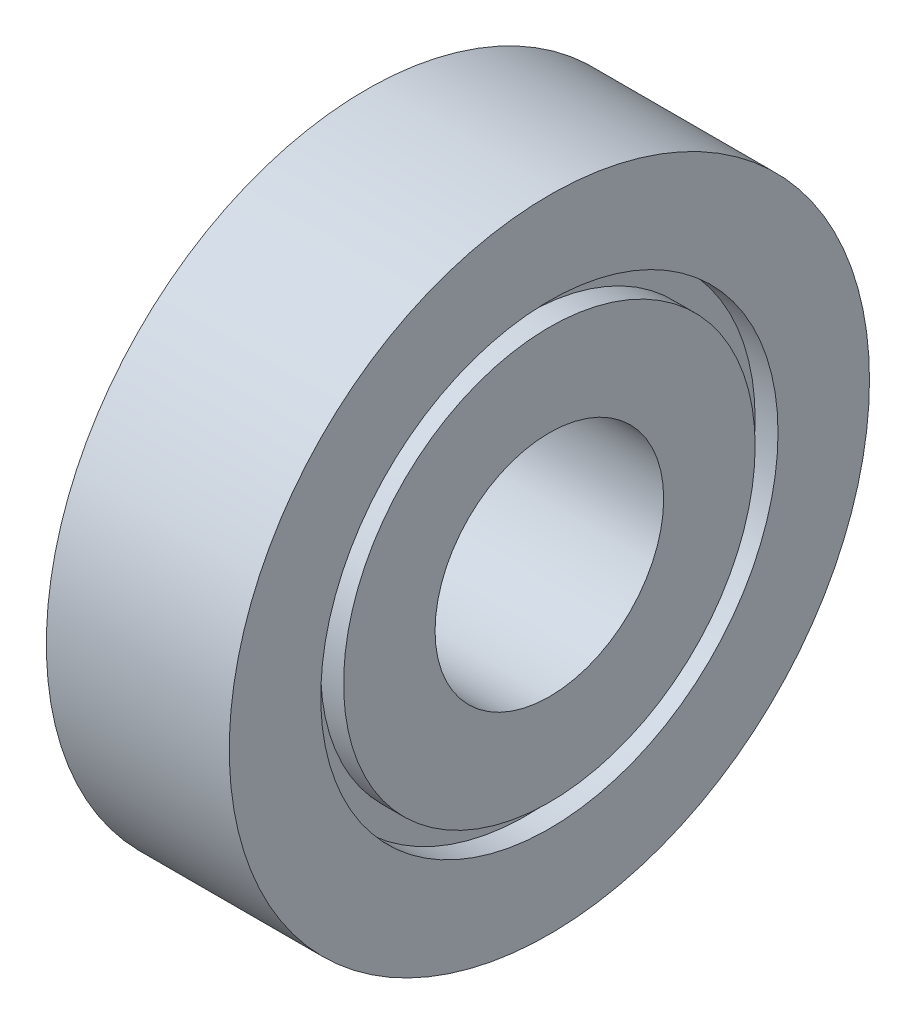
ISO-10303-21;
HEADER;
FILE_DESCRIPTION(('STEP AP214'),'2;1');
FILE_NAME('part.step','',(''),(''),'','','');
FILE_SCHEMA(('AUTOMOTIVE_DESIGN { 1 0 10303 214 1 1 1 1 }'));
ENDSEC;
DATA;
#1=APPLICATION_CONTEXT('core data for automotive mechanical design processes');
#2=APPLICATION_PROTOCOL_DEFINITION('international standard','automotive_design',2000,#1);
#3=PRODUCT_CONTEXT('',#1,'mechanical');
#4=PRODUCT('Part','Part','',(#3));
#5=PRODUCT_RELATED_PRODUCT_CATEGORY('part','',(#4));
#6=PRODUCT_DEFINITION_FORMATION('','',#4);
#7=PRODUCT_DEFINITION_CONTEXT('part definition',#1,'design');
#8=PRODUCT_DEFINITION('design','',#6,#7);
#9=PRODUCT_DEFINITION_SHAPE('','',#8);
#10=(LENGTH_UNIT() NAMED_UNIT(*) SI_UNIT(.MILLI.,.METRE.));
#11=(NAMED_UNIT(*) PLANE_ANGLE_UNIT() SI_UNIT($,.RADIAN.));
#12=(NAMED_UNIT(*) SI_UNIT($,.STERADIAN.) SOLID_ANGLE_UNIT());
#13=UNCERTAINTY_MEASURE_WITH_UNIT(LENGTH_MEASURE(1.E-05),#10,'distance_accuracy_value','');
#14=(GEOMETRIC_REPRESENTATION_CONTEXT(3) GLOBAL_UNCERTAINTY_ASSIGNED_CONTEXT((#13)) GLOBAL_UNIT_ASSIGNED_CONTEXT((#10,
#11,#12)) REPRESENTATION_CONTEXT('',''));
#15=CARTESIAN_POINT('',(0.,0.,0.));
#16=DIRECTION('',(0.,0.,1.));
#17=DIRECTION('',(1.,0.,0.));
#18=AXIS2_PLACEMENT_3D('',#15,#16,#17);
#19=CARTESIAN_POINT('',(2.,0.,0.));
#20=DIRECTION('',(-1.,0.,0.));
#21=DIRECTION('',(0.,0.,1.));
#22=AXIS2_PLACEMENT_3D('',#19,#20,#21);
#23=CYLINDRICAL_SURFACE('',#22,5.);
#24=CARTESIAN_POINT('',(-2.,0.,0.));
#25=DIRECTION('',(1.,0.,0.));
#26=DIRECTION('',(0.,0.,-1.));
#27=AXIS2_PLACEMENT_3D('',#24,#25,#26);
#28=CIRCLE('',#27,5.);
#29=CARTESIAN_POINT('',(-2.,0.,-5.));
#30=VERTEX_POINT('',#29);
#31=EDGE_CURVE('E60',#30,#30,#28,.T.);
#32=ORIENTED_EDGE('',*,*,#31,.F.);
#33=EDGE_LOOP('',(#32));
#34=FACE_BOUND('',#33,.T.);
#35=CARTESIAN_POINT('',(-1.5,0.,0.));
#36=DIRECTION('',(1.,0.,0.));
#37=DIRECTION('',(0.,0.,-1.));
#38=AXIS2_PLACEMENT_3D('',#35,#36,#37);
#39=CIRCLE('',#38,5.);
#40=CARTESIAN_POINT('',(-1.5,0.,-5.));
#41=VERTEX_POINT('',#40);
#42=EDGE_CURVE('E95',#41,#41,#39,.T.);
#43=ORIENTED_EDGE('',*,*,#42,.T.);
#44=EDGE_LOOP('',(#43));
#45=FACE_BOUND('',#44,.T.);
#46=ADVANCED_FACE('F37',(#34,#45),#23,.F.);
#47=CARTESIAN_POINT('',(1.5,0.,0.));
#48=DIRECTION('',(1.,0.,0.));
#49=DIRECTION('',(0.,0.,-1.));
#50=AXIS2_PLACEMENT_3D('',#47,#48,#49);
#51=CIRCLE('',#50,5.);
#52=CARTESIAN_POINT('',(1.5,0.,-5.));
#53=VERTEX_POINT('',#52);
#54=EDGE_CURVE('E10',#53,#53,#51,.T.);
#55=ORIENTED_EDGE('',*,*,#54,.F.);
#56=EDGE_LOOP('',(#55));
#57=FACE_BOUND('',#56,.T.);
#58=CARTESIAN_POINT('',(2.,0.,0.));
#59=DIRECTION('',(1.,0.,0.));
#60=DIRECTION('',(0.,0.,-1.));
#61=AXIS2_PLACEMENT_3D('',#58,#59,#60);
#62=CIRCLE('',#61,5.);
#63=CARTESIAN_POINT('',(2.,0.,-5.));
#64=VERTEX_POINT('',#63);
#65=EDGE_CURVE('E50',#64,#64,#62,.T.);
#66=ORIENTED_EDGE('',*,*,#65,.T.);
#67=EDGE_LOOP('',(#66));
#68=FACE_BOUND('',#67,.T.);
#69=ADVANCED_FACE('F39',(#57,#68),#23,.F.);
#70=CARTESIAN_POINT('',(2.,0.,0.));
#71=DIRECTION('',(-1.,0.,0.));
#72=DIRECTION('',(0.,0.,1.));
#73=AXIS2_PLACEMENT_3D('',#70,#71,#72);
#74=CYLINDRICAL_SURFACE('',#73,7.);
#75=CARTESIAN_POINT('',(2.,0.,0.));
#76=DIRECTION('',(1.,0.,0.));
#77=DIRECTION('',(0.,0.,-1.));
#78=AXIS2_PLACEMENT_3D('',#75,#76,#77);
#79=CIRCLE('',#78,7.);
#80=CARTESIAN_POINT('',(2.,0.,-7.));
#81=VERTEX_POINT('',#80);
#82=EDGE_CURVE('E45',#81,#81,#79,.T.);
#83=ORIENTED_EDGE('',*,*,#82,.F.);
#84=EDGE_LOOP('',(#83));
#85=FACE_BOUND('',#84,.T.);
#86=CARTESIAN_POINT('',(-2.,0.,0.));
#87=DIRECTION('',(1.,0.,0.));
#88=DIRECTION('',(0.,0.,-1.));
#89=AXIS2_PLACEMENT_3D('',#86,#87,#88);
#90=CIRCLE('',#89,7.);
#91=CARTESIAN_POINT('',(-2.,0.,-7.));
#92=VERTEX_POINT('',#91);
#93=EDGE_CURVE('E56',#92,#92,#90,.T.);
#94=ORIENTED_EDGE('',*,*,#93,.T.);
#95=EDGE_LOOP('',(#94));
#96=FACE_BOUND('',#95,.T.);
#97=ADVANCED_FACE('F68',(#85,#96),#74,.T.);
#98=CARTESIAN_POINT('',(2.,0.,0.));
#99=DIRECTION('',(1.,0.,0.));
#100=DIRECTION('',(0.,0.,-1.));
#101=AXIS2_PLACEMENT_3D('',#98,#99,#100);
#102=PLANE('',#101);
#103=ORIENTED_EDGE('',*,*,#65,.F.);
#104=EDGE_LOOP('',(#103));
#105=FACE_BOUND('',#104,.T.);
#106=ORIENTED_EDGE('',*,*,#82,.T.);
#107=EDGE_LOOP('',(#106));
#108=FACE_BOUND('',#107,.T.);
#109=ADVANCED_FACE('F73',(#105,#108),#102,.T.);
#110=CARTESIAN_POINT('',(-2.,0.,0.));
#111=DIRECTION('',(1.,0.,0.));
#112=DIRECTION('',(0.,0.,-1.));
#113=AXIS2_PLACEMENT_3D('',#110,#111,#112);
#114=PLANE('',#113);
#115=ORIENTED_EDGE('',*,*,#31,.T.);
#116=EDGE_LOOP('',(#115));
#117=FACE_BOUND('',#116,.T.);
#118=ORIENTED_EDGE('',*,*,#93,.F.);
#119=EDGE_LOOP('',(#118));
#120=FACE_BOUND('',#119,.T.);
#121=ADVANCED_FACE('F70',(#117,#120),#114,.F.);
#122=CARTESIAN_POINT('',(1.5,0.,0.));
#123=DIRECTION('',(1.,0.,0.));
#124=DIRECTION('',(0.,0.,-1.));
#125=AXIS2_PLACEMENT_3D('',#122,#123,#124);
#126=PLANE('',#125);
#127=CARTESIAN_POINT('',(1.5,0.,0.));
#128=DIRECTION('',(1.,0.,0.));
#129=DIRECTION('',(0.,0.,-1.));
#130=AXIS2_PLACEMENT_3D('',#127,#128,#129);
#131=CIRCLE('',#130,4.5);
#132=CARTESIAN_POINT('',(1.5,0.,-4.5));
#133=VERTEX_POINT('',#132);
#134=EDGE_CURVE('E63',#133,#133,#131,.T.);
#135=ORIENTED_EDGE('',*,*,#134,.F.);
#136=EDGE_LOOP('',(#135));
#137=FACE_BOUND('',#136,.T.);
#138=ORIENTED_EDGE('',*,*,#54,.T.);
#139=EDGE_LOOP('',(#138));
#140=FACE_BOUND('',#139,.T.);
#141=ADVANCED_FACE('F72',(#137,#140),#126,.T.);
#142=CARTESIAN_POINT('',(-1.5,0.,0.));
#143=DIRECTION('',(1.,0.,0.));
#144=DIRECTION('',(0.,0.,-1.));
#145=AXIS2_PLACEMENT_3D('',#142,#143,#144);
#146=PLANE('',#145);
#147=CARTESIAN_POINT('',(-1.5,0.,0.));
#148=DIRECTION('',(1.,0.,0.));
#149=DIRECTION('',(0.,0.,-1.));
#150=AXIS2_PLACEMENT_3D('',#147,#148,#149);
#151=CIRCLE('',#150,4.5);
#152=CARTESIAN_POINT('',(-1.5,0.,-4.5));
#153=VERTEX_POINT('',#152);
#154=EDGE_CURVE('E98',#153,#153,#151,.F.);
#155=ORIENTED_EDGE('',*,*,#154,.F.);
#156=EDGE_LOOP('',(#155));
#157=FACE_BOUND('',#156,.T.);
#158=ORIENTED_EDGE('',*,*,#42,.F.);
#159=EDGE_LOOP('',(#158));
#160=FACE_BOUND('',#159,.T.);
#161=ADVANCED_FACE('F80',(#157,#160),#146,.F.);
#162=CARTESIAN_POINT('',(2.,0.,0.));
#163=DIRECTION('',(-1.,0.,0.));
#164=DIRECTION('',(0.,0.,1.));
#165=AXIS2_PLACEMENT_3D('',#162,#163,#164);
#166=CYLINDRICAL_SURFACE('',#165,4.5);
#167=CARTESIAN_POINT('',(-2.,0.,0.));
#168=DIRECTION('',(1.,0.,0.));
#169=DIRECTION('',(0.,0.,-1.));
#170=AXIS2_PLACEMENT_3D('',#167,#168,#169);
#171=CIRCLE('',#170,4.5);
#172=CARTESIAN_POINT('',(-2.,0.,-4.5));
#173=VERTEX_POINT('',#172);
#174=EDGE_CURVE('E107',#173,#173,#171,.T.);
#175=ORIENTED_EDGE('',*,*,#174,.T.);
#176=EDGE_LOOP('',(#175));
#177=FACE_BOUND('',#176,.T.);
#178=ORIENTED_EDGE('',*,*,#154,.T.);
#179=EDGE_LOOP('',(#178));
#180=FACE_BOUND('',#179,.T.);
#181=ADVANCED_FACE('F137',(#177,#180),#166,.T.);
#182=CARTESIAN_POINT('',(2.,0.,0.));
#183=DIRECTION('',(-1.,0.,0.));
#184=DIRECTION('',(0.,0.,1.));
#185=AXIS2_PLACEMENT_3D('',#182,#183,#184);
#186=CYLINDRICAL_SURFACE('',#185,2.5);
#187=CARTESIAN_POINT('',(2.,0.,0.));
#188=DIRECTION('',(1.,0.,0.));
#189=DIRECTION('',(0.,0.,-1.));
#190=AXIS2_PLACEMENT_3D('',#187,#188,#189);
#191=CIRCLE('',#190,2.5);
#192=CARTESIAN_POINT('',(2.,0.,-2.5));
#193=VERTEX_POINT('',#192);
#194=EDGE_CURVE('E111',#193,#193,#191,.T.);
#195=ORIENTED_EDGE('',*,*,#194,.T.);
#196=EDGE_LOOP('',(#195));
#197=FACE_BOUND('',#196,.T.);
#198=CARTESIAN_POINT('',(-2.,0.,0.));
#199=DIRECTION('',(1.,0.,0.));
#200=DIRECTION('',(0.,0.,-1.));
#201=AXIS2_PLACEMENT_3D('',#198,#199,#200);
#202=CIRCLE('',#201,2.5);
#203=CARTESIAN_POINT('',(-2.,0.,-2.5));
#204=VERTEX_POINT('',#203);
#205=EDGE_CURVE('E112',#204,#204,#202,.T.);
#206=ORIENTED_EDGE('',*,*,#205,.F.);
#207=EDGE_LOOP('',(#206));
#208=FACE_BOUND('',#207,.T.);
#209=ADVANCED_FACE('F123',(#197,#208),#186,.F.);
#210=ORIENTED_EDGE('',*,*,#134,.T.);
#211=EDGE_LOOP('',(#210));
#212=FACE_BOUND('',#211,.T.);
#213=CARTESIAN_POINT('',(2.,0.,0.));
#214=DIRECTION('',(1.,0.,0.));
#215=DIRECTION('',(0.,0.,-1.));
#216=AXIS2_PLACEMENT_3D('',#213,#214,#215);
#217=CIRCLE('',#216,4.5);
#218=CARTESIAN_POINT('',(2.,0.,-4.5));
#219=VERTEX_POINT('',#218);
#220=EDGE_CURVE('E104',#219,#219,#217,.T.);
#221=ORIENTED_EDGE('',*,*,#220,.F.);
#222=EDGE_LOOP('',(#221));
#223=FACE_BOUND('',#222,.T.);
#224=ADVANCED_FACE('F130',(#212,#223),#166,.T.);
#225=CARTESIAN_POINT('',(2.,0.,0.));
#226=DIRECTION('',(1.,0.,0.));
#227=DIRECTION('',(0.,0.,-1.));
#228=AXIS2_PLACEMENT_3D('',#225,#226,#227);
#229=PLANE('',#228);
#230=ORIENTED_EDGE('',*,*,#194,.F.);
#231=EDGE_LOOP('',(#230));
#232=FACE_BOUND('',#231,.T.);
#233=ORIENTED_EDGE('',*,*,#220,.T.);
#234=EDGE_LOOP('',(#233));
#235=FACE_BOUND('',#234,.T.);
#236=ADVANCED_FACE('F126',(#232,#235),#229,.T.);
#237=CARTESIAN_POINT('',(-2.,0.,0.));
#238=DIRECTION('',(1.,0.,0.));
#239=DIRECTION('',(0.,0.,-1.));
#240=AXIS2_PLACEMENT_3D('',#237,#238,#239);
#241=PLANE('',#240);
#242=ORIENTED_EDGE('',*,*,#205,.T.);
#243=EDGE_LOOP('',(#242));
#244=FACE_BOUND('',#243,.T.);
#245=ORIENTED_EDGE('',*,*,#174,.F.);
#246=EDGE_LOOP('',(#245));
#247=FACE_BOUND('',#246,.T.);
#248=ADVANCED_FACE('F129',(#244,#247),#241,.F.);
#249=CLOSED_SHELL('',(#46,#69,#97,#109,#121,#141,#161,#181,#209,#224,#236,#248));
#250=MANIFOLD_SOLID_BREP('B2',#249);
#251=ADVANCED_BREP_SHAPE_REPRESENTATION('',(#18,#250),#14);
#252=SHAPE_DEFINITION_REPRESENTATION(#9,#251);
ENDSEC;
END-ISO-10303-21;
